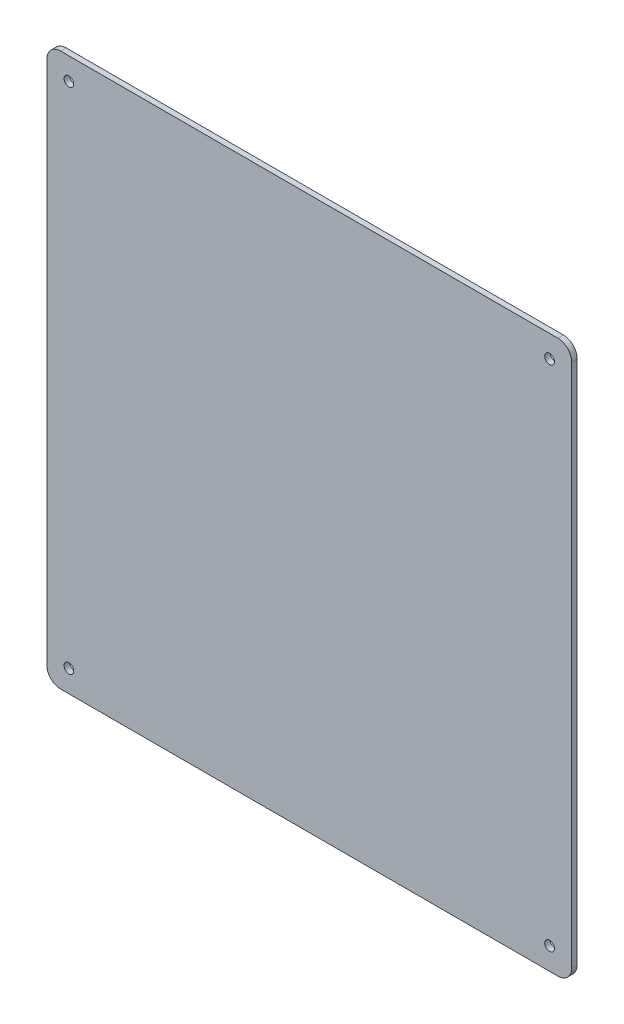
ISO-10303-21;
HEADER;
FILE_DESCRIPTION(('STEP AP214'),'2;1');
FILE_NAME('part.step','',(''),(''),'','','');
FILE_SCHEMA(('AUTOMOTIVE_DESIGN { 1 0 10303 214 1 1 1 1 }'));
ENDSEC;
DATA;
#1=APPLICATION_CONTEXT('core data for automotive mechanical design processes');
#2=APPLICATION_PROTOCOL_DEFINITION('international standard','automotive_design',2000,#1);
#3=PRODUCT_CONTEXT('',#1,'mechanical');
#4=PRODUCT('Part','Part','',(#3));
#5=PRODUCT_RELATED_PRODUCT_CATEGORY('part','',(#4));
#6=PRODUCT_DEFINITION_FORMATION('','',#4);
#7=PRODUCT_DEFINITION_CONTEXT('part definition',#1,'design');
#8=PRODUCT_DEFINITION('design','',#6,#7);
#9=PRODUCT_DEFINITION_SHAPE('','',#8);
#10=(LENGTH_UNIT() NAMED_UNIT(*) SI_UNIT(.MILLI.,.METRE.));
#11=(NAMED_UNIT(*) PLANE_ANGLE_UNIT() SI_UNIT($,.RADIAN.));
#12=(NAMED_UNIT(*) SI_UNIT($,.STERADIAN.) SOLID_ANGLE_UNIT());
#13=UNCERTAINTY_MEASURE_WITH_UNIT(LENGTH_MEASURE(1.E-05),#10,'distance_accuracy_value','');
#14=(GEOMETRIC_REPRESENTATION_CONTEXT(3) GLOBAL_UNCERTAINTY_ASSIGNED_CONTEXT((#13)) GLOBAL_UNIT_ASSIGNED_CONTEXT((#10,
#11,#12)) REPRESENTATION_CONTEXT('',''));
#15=CARTESIAN_POINT('',(0.,0.,0.));
#16=DIRECTION('',(0.,0.,1.));
#17=DIRECTION('',(1.,0.,0.));
#18=AXIS2_PLACEMENT_3D('',#15,#16,#17);
#19=CARTESIAN_POINT('',(-133.612137779047,74.3506493506493,2.));
#20=DIRECTION('',(1.,0.,0.));
#21=DIRECTION('',(0.,1.,0.));
#22=AXIS2_PLACEMENT_3D('',#19,#20,#21);
#23=PLANE('',#22);
#24=DIRECTION('',(0.,-1.,0.));
#25=VECTOR('',#24,1.);
#26=CARTESIAN_POINT('',(-133.612137779047,74.3506493506493,0.));
#27=LINE('',#26,#25);
#28=CARTESIAN_POINT('',(-133.612137779047,69.3506493506493,0.));
#29=VERTEX_POINT('',#28);
#30=CARTESIAN_POINT('',(-133.612137779047,-120.649350649351,0.));
#31=VERTEX_POINT('',#30);
#32=EDGE_CURVE('E158',#29,#31,#27,.T.);
#33=ORIENTED_EDGE('',*,*,#32,.T.);
#34=DIRECTION('',(0.,0.,-1.));
#35=VECTOR('',#34,1.);
#36=CARTESIAN_POINT('',(-133.612137779047,-120.649350649351,2.));
#37=LINE('',#36,#35);
#38=CARTESIAN_POINT('',(-133.612137779047,-120.649350649351,2.));
#39=VERTEX_POINT('',#38);
#40=EDGE_CURVE('E11',#31,#39,#37,.F.);
#41=ORIENTED_EDGE('',*,*,#40,.T.);
#42=DIRECTION('',(0.,-1.,0.));
#43=VECTOR('',#42,1.);
#44=CARTESIAN_POINT('',(-133.612137779047,74.3506493506493,2.));
#45=LINE('',#44,#43);
#46=CARTESIAN_POINT('',(-133.612137779047,69.3506493506493,2.));
#47=VERTEX_POINT('',#46);
#48=EDGE_CURVE('E126',#47,#39,#45,.T.);
#49=ORIENTED_EDGE('',*,*,#48,.F.);
#50=DIRECTION('',(0.,0.,-1.));
#51=VECTOR('',#50,1.);
#52=CARTESIAN_POINT('',(-133.612137779047,69.3506493506493,2.));
#53=LINE('',#52,#51);
#54=EDGE_CURVE('E42',#47,#29,#53,.T.);
#55=ORIENTED_EDGE('',*,*,#54,.T.);
#56=EDGE_LOOP('',(#33,#41,#49,#55));
#57=FACE_BOUND('',#56,.T.);
#58=ADVANCED_FACE('F34',(#57),#23,.F.);
#59=CARTESIAN_POINT('',(-133.612137779047,-125.649350649351,2.));
#60=DIRECTION('',(0.,1.,0.));
#61=DIRECTION('',(0.,0.,1.));
#62=AXIS2_PLACEMENT_3D('',#59,#60,#61);
#63=PLANE('',#62);
#64=DIRECTION('',(1.,0.,0.));
#65=VECTOR('',#64,1.);
#66=CARTESIAN_POINT('',(-133.612137779047,-125.649350649351,0.));
#67=LINE('',#66,#65);
#68=CARTESIAN_POINT('',(-128.612137779047,-125.649350649351,0.));
#69=VERTEX_POINT('',#68);
#70=CARTESIAN_POINT('',(51.3878622209533,-125.649350649351,0.));
#71=VERTEX_POINT('',#70);
#72=EDGE_CURVE('E131',#69,#71,#67,.T.);
#73=ORIENTED_EDGE('',*,*,#72,.T.);
#74=DIRECTION('',(0.,0.,-1.));
#75=VECTOR('',#74,1.);
#76=CARTESIAN_POINT('',(51.3878622209533,-125.649350649351,2.));
#77=LINE('',#76,#75);
#78=CARTESIAN_POINT('',(51.3878622209533,-125.649350649351,2.));
#79=VERTEX_POINT('',#78);
#80=EDGE_CURVE('E49',#71,#79,#77,.F.);
#81=ORIENTED_EDGE('',*,*,#80,.T.);
#82=DIRECTION('',(1.,0.,0.));
#83=VECTOR('',#82,1.);
#84=CARTESIAN_POINT('',(-133.612137779047,-125.649350649351,2.));
#85=LINE('',#84,#83);
#86=CARTESIAN_POINT('',(-128.612137779047,-125.649350649351,2.));
#87=VERTEX_POINT('',#86);
#88=EDGE_CURVE('E129',#87,#79,#85,.T.);
#89=ORIENTED_EDGE('',*,*,#88,.F.);
#90=DIRECTION('',(0.,0.,-1.));
#91=VECTOR('',#90,1.);
#92=CARTESIAN_POINT('',(-128.612137779047,-125.649350649351,2.));
#93=LINE('',#92,#91);
#94=EDGE_CURVE('E150',#87,#69,#93,.T.);
#95=ORIENTED_EDGE('',*,*,#94,.T.);
#96=EDGE_LOOP('',(#73,#81,#89,#95));
#97=FACE_BOUND('',#96,.T.);
#98=ADVANCED_FACE('F218',(#97),#63,.F.);
#99=CARTESIAN_POINT('',(56.3878622209533,74.3506493506493,2.));
#100=DIRECTION('',(-1.,0.,0.));
#101=DIRECTION('',(0.,-1.,0.));
#102=AXIS2_PLACEMENT_3D('',#99,#100,#101);
#103=PLANE('',#102);
#104=DIRECTION('',(0.,1.,0.));
#105=VECTOR('',#104,1.);
#106=CARTESIAN_POINT('',(56.3878622209533,74.3506493506493,0.));
#107=LINE('',#106,#105);
#108=CARTESIAN_POINT('',(56.3878622209533,-120.649350649351,0.));
#109=VERTEX_POINT('',#108);
#110=CARTESIAN_POINT('',(56.3878622209533,69.3506493506493,0.));
#111=VERTEX_POINT('',#110);
#112=EDGE_CURVE('E127',#109,#111,#107,.T.);
#113=ORIENTED_EDGE('',*,*,#112,.T.);
#114=DIRECTION('',(0.,0.,-1.));
#115=VECTOR('',#114,1.);
#116=CARTESIAN_POINT('',(56.3878622209533,69.3506493506493,2.));
#117=LINE('',#116,#115);
#118=CARTESIAN_POINT('',(56.3878622209533,69.3506493506493,2.));
#119=VERTEX_POINT('',#118);
#120=EDGE_CURVE('E105',#111,#119,#117,.F.);
#121=ORIENTED_EDGE('',*,*,#120,.T.);
#122=DIRECTION('',(0.,1.,0.));
#123=VECTOR('',#122,1.);
#124=CARTESIAN_POINT('',(56.3878622209533,74.3506493506493,2.));
#125=LINE('',#124,#123);
#126=CARTESIAN_POINT('',(56.3878622209533,-120.649350649351,2.));
#127=VERTEX_POINT('',#126);
#128=EDGE_CURVE('E170',#127,#119,#125,.T.);
#129=ORIENTED_EDGE('',*,*,#128,.F.);
#130=DIRECTION('',(0.,0.,-1.));
#131=VECTOR('',#130,1.);
#132=CARTESIAN_POINT('',(56.3878622209533,-120.649350649351,2.));
#133=LINE('',#132,#131);
#134=EDGE_CURVE('E110',#127,#109,#133,.T.);
#135=ORIENTED_EDGE('',*,*,#134,.T.);
#136=EDGE_LOOP('',(#113,#121,#129,#135));
#137=FACE_BOUND('',#136,.T.);
#138=ADVANCED_FACE('F215',(#137),#103,.F.);
#139=CARTESIAN_POINT('',(-133.612137779047,74.3506493506493,2.));
#140=DIRECTION('',(0.,-1.,0.));
#141=DIRECTION('',(0.,0.,-1.));
#142=AXIS2_PLACEMENT_3D('',#139,#140,#141);
#143=PLANE('',#142);
#144=DIRECTION('',(-1.,0.,0.));
#145=VECTOR('',#144,1.);
#146=CARTESIAN_POINT('',(-133.612137779047,74.3506493506493,2.));
#147=LINE('',#146,#145);
#148=CARTESIAN_POINT('',(51.3878622209533,74.3506493506493,2.));
#149=VERTEX_POINT('',#148);
#150=CARTESIAN_POINT('',(-128.612137779047,74.3506493506493,2.));
#151=VERTEX_POINT('',#150);
#152=EDGE_CURVE('E120',#149,#151,#147,.T.);
#153=ORIENTED_EDGE('',*,*,#152,.F.);
#154=DIRECTION('',(0.,0.,-1.));
#155=VECTOR('',#154,1.);
#156=CARTESIAN_POINT('',(51.3878622209533,74.3506493506493,2.));
#157=LINE('',#156,#155);
#158=CARTESIAN_POINT('',(51.3878622209533,74.3506493506493,0.));
#159=VERTEX_POINT('',#158);
#160=EDGE_CURVE('E104',#149,#159,#157,.T.);
#161=ORIENTED_EDGE('',*,*,#160,.T.);
#162=DIRECTION('',(-1.,0.,0.));
#163=VECTOR('',#162,1.);
#164=CARTESIAN_POINT('',(-133.612137779047,74.3506493506493,0.));
#165=LINE('',#164,#163);
#166=CARTESIAN_POINT('',(-128.612137779047,74.3506493506493,0.));
#167=VERTEX_POINT('',#166);
#168=EDGE_CURVE('E117',#159,#167,#165,.T.);
#169=ORIENTED_EDGE('',*,*,#168,.T.);
#170=DIRECTION('',(0.,0.,-1.));
#171=VECTOR('',#170,1.);
#172=CARTESIAN_POINT('',(-128.612137779047,74.3506493506493,2.));
#173=LINE('',#172,#171);
#174=EDGE_CURVE('E122',#167,#151,#173,.F.);
#175=ORIENTED_EDGE('',*,*,#174,.T.);
#176=EDGE_LOOP('',(#153,#161,#169,#175));
#177=FACE_BOUND('',#176,.T.);
#178=ADVANCED_FACE('F116',(#177),#143,.F.);
#179=CARTESIAN_POINT('',(0.,0.,2.));
#180=DIRECTION('',(0.,0.,1.));
#181=DIRECTION('',(1.,0.,0.));
#182=AXIS2_PLACEMENT_3D('',#179,#180,#181);
#183=PLANE('',#182);
#184=CARTESIAN_POINT('',(48.3878622209533,66.3506493506493,2.));
#185=DIRECTION('',(0.,0.,1.));
#186=DIRECTION('',(1.,0.,0.));
#187=AXIS2_PLACEMENT_3D('',#184,#185,#186);
#188=CIRCLE('',#187,1.75);
#189=CARTESIAN_POINT('',(50.1378622209533,66.3506493506493,2.));
#190=VERTEX_POINT('',#189);
#191=EDGE_CURVE('E184',#190,#190,#188,.T.);
#192=ORIENTED_EDGE('',*,*,#191,.F.);
#193=EDGE_LOOP('',(#192));
#194=FACE_BOUND('',#193,.T.);
#195=CARTESIAN_POINT('',(-125.612137779047,-117.649350649351,2.));
#196=DIRECTION('',(0.,0.,1.));
#197=DIRECTION('',(1.,0.,0.));
#198=AXIS2_PLACEMENT_3D('',#195,#196,#197);
#199=CIRCLE('',#198,1.75);
#200=CARTESIAN_POINT('',(-123.862137779047,-117.649350649351,2.));
#201=VERTEX_POINT('',#200);
#202=EDGE_CURVE('E177',#201,#201,#199,.T.);
#203=ORIENTED_EDGE('',*,*,#202,.F.);
#204=EDGE_LOOP('',(#203));
#205=FACE_BOUND('',#204,.T.);
#206=CARTESIAN_POINT('',(48.3878622209533,-117.649350649351,2.));
#207=DIRECTION('',(0.,0.,1.));
#208=DIRECTION('',(1.,0.,0.));
#209=AXIS2_PLACEMENT_3D('',#206,#207,#208);
#210=CIRCLE('',#209,1.75);
#211=CARTESIAN_POINT('',(50.1378622209533,-117.649350649351,2.));
#212=VERTEX_POINT('',#211);
#213=EDGE_CURVE('E189',#212,#212,#210,.T.);
#214=ORIENTED_EDGE('',*,*,#213,.F.);
#215=EDGE_LOOP('',(#214));
#216=FACE_BOUND('',#215,.T.);
#217=CARTESIAN_POINT('',(-125.612137779047,66.3506493506493,2.));
#218=DIRECTION('',(0.,0.,1.));
#219=DIRECTION('',(1.,0.,0.));
#220=AXIS2_PLACEMENT_3D('',#217,#218,#219);
#221=CIRCLE('',#220,1.75);
#222=CARTESIAN_POINT('',(-123.862137779047,66.3506493506493,2.));
#223=VERTEX_POINT('',#222);
#224=EDGE_CURVE('E166',#223,#223,#221,.T.);
#225=ORIENTED_EDGE('',*,*,#224,.F.);
#226=EDGE_LOOP('',(#225));
#227=FACE_BOUND('',#226,.T.);
#228=ORIENTED_EDGE('',*,*,#128,.T.);
#229=CARTESIAN_POINT('',(51.3878622209533,69.3506493506493,2.));
#230=DIRECTION('',(0.,0.,1.));
#231=DIRECTION('',(1.,0.,0.));
#232=AXIS2_PLACEMENT_3D('',#229,#230,#231);
#233=CIRCLE('',#232,5.);
#234=EDGE_CURVE('E148',#119,#149,#233,.T.);
#235=ORIENTED_EDGE('',*,*,#234,.T.);
#236=ORIENTED_EDGE('',*,*,#152,.T.);
#237=CARTESIAN_POINT('',(-128.612137779047,69.3506493506493,2.));
#238=DIRECTION('',(0.,0.,1.));
#239=DIRECTION('',(1.,0.,0.));
#240=AXIS2_PLACEMENT_3D('',#237,#238,#239);
#241=CIRCLE('',#240,5.);
#242=EDGE_CURVE('E143',#151,#47,#241,.T.);
#243=ORIENTED_EDGE('',*,*,#242,.T.);
#244=ORIENTED_EDGE('',*,*,#48,.T.);
#245=CARTESIAN_POINT('',(-128.612137779047,-120.649350649351,2.));
#246=DIRECTION('',(0.,0.,1.));
#247=DIRECTION('',(1.,0.,0.));
#248=AXIS2_PLACEMENT_3D('',#245,#246,#247);
#249=CIRCLE('',#248,5.);
#250=EDGE_CURVE('E56',#39,#87,#249,.T.);
#251=ORIENTED_EDGE('',*,*,#250,.T.);
#252=ORIENTED_EDGE('',*,*,#88,.T.);
#253=CARTESIAN_POINT('',(51.3878622209533,-120.649350649351,2.));
#254=DIRECTION('',(0.,0.,1.));
#255=DIRECTION('',(1.,0.,0.));
#256=AXIS2_PLACEMENT_3D('',#253,#254,#255);
#257=CIRCLE('',#256,5.);
#258=EDGE_CURVE('E146',#79,#127,#257,.T.);
#259=ORIENTED_EDGE('',*,*,#258,.T.);
#260=EDGE_LOOP('',(#228,#235,#236,#243,#244,#251,#252,#259));
#261=FACE_BOUND('',#260,.T.);
#262=ADVANCED_FACE('F205',(#194,#205,#216,#227,#261),#183,.T.);
#263=CARTESIAN_POINT('',(0.,0.,0.));
#264=DIRECTION('',(0.,0.,1.));
#265=DIRECTION('',(1.,0.,0.));
#266=AXIS2_PLACEMENT_3D('',#263,#264,#265);
#267=PLANE('',#266);
#268=CARTESIAN_POINT('',(48.3878622209533,66.3506493506493,0.));
#269=DIRECTION('',(0.,0.,1.));
#270=DIRECTION('',(1.,0.,0.));
#271=AXIS2_PLACEMENT_3D('',#268,#269,#270);
#272=CIRCLE('',#271,1.75);
#273=CARTESIAN_POINT('',(50.1378622209533,66.3506493506493,0.));
#274=VERTEX_POINT('',#273);
#275=EDGE_CURVE('E175',#274,#274,#272,.T.);
#276=ORIENTED_EDGE('',*,*,#275,.T.);
#277=EDGE_LOOP('',(#276));
#278=FACE_BOUND('',#277,.T.);
#279=CARTESIAN_POINT('',(-125.612137779047,-117.649350649351,0.));
#280=DIRECTION('',(0.,0.,1.));
#281=DIRECTION('',(1.,0.,0.));
#282=AXIS2_PLACEMENT_3D('',#279,#280,#281);
#283=CIRCLE('',#282,1.75);
#284=CARTESIAN_POINT('',(-123.862137779047,-117.649350649351,0.));
#285=VERTEX_POINT('',#284);
#286=EDGE_CURVE('E180',#285,#285,#283,.T.);
#287=ORIENTED_EDGE('',*,*,#286,.T.);
#288=EDGE_LOOP('',(#287));
#289=FACE_BOUND('',#288,.T.);
#290=CARTESIAN_POINT('',(48.3878622209533,-117.649350649351,0.));
#291=DIRECTION('',(0.,0.,1.));
#292=DIRECTION('',(1.,0.,0.));
#293=AXIS2_PLACEMENT_3D('',#290,#291,#292);
#294=CIRCLE('',#293,1.75);
#295=CARTESIAN_POINT('',(50.1378622209533,-117.649350649351,0.));
#296=VERTEX_POINT('',#295);
#297=EDGE_CURVE('E181',#296,#296,#294,.T.);
#298=ORIENTED_EDGE('',*,*,#297,.T.);
#299=EDGE_LOOP('',(#298));
#300=FACE_BOUND('',#299,.T.);
#301=CARTESIAN_POINT('',(-125.612137779047,66.3506493506493,0.));
#302=DIRECTION('',(0.,0.,1.));
#303=DIRECTION('',(1.,0.,0.));
#304=AXIS2_PLACEMENT_3D('',#301,#302,#303);
#305=CIRCLE('',#304,1.75);
#306=CARTESIAN_POINT('',(-123.862137779047,66.3506493506493,0.));
#307=VERTEX_POINT('',#306);
#308=EDGE_CURVE('E163',#307,#307,#305,.T.);
#309=ORIENTED_EDGE('',*,*,#308,.T.);
#310=EDGE_LOOP('',(#309));
#311=FACE_BOUND('',#310,.T.);
#312=ORIENTED_EDGE('',*,*,#168,.F.);
#313=CARTESIAN_POINT('',(51.3878622209533,69.3506493506493,0.));
#314=DIRECTION('',(0.,0.,1.));
#315=DIRECTION('',(1.,0.,0.));
#316=AXIS2_PLACEMENT_3D('',#313,#314,#315);
#317=CIRCLE('',#316,5.);
#318=EDGE_CURVE('E100',#159,#111,#317,.F.);
#319=ORIENTED_EDGE('',*,*,#318,.T.);
#320=ORIENTED_EDGE('',*,*,#112,.F.);
#321=CARTESIAN_POINT('',(51.3878622209533,-120.649350649351,0.));
#322=DIRECTION('',(0.,0.,1.));
#323=DIRECTION('',(1.,0.,0.));
#324=AXIS2_PLACEMENT_3D('',#321,#322,#323);
#325=CIRCLE('',#324,5.);
#326=EDGE_CURVE('E111',#109,#71,#325,.F.);
#327=ORIENTED_EDGE('',*,*,#326,.T.);
#328=ORIENTED_EDGE('',*,*,#72,.F.);
#329=CARTESIAN_POINT('',(-128.612137779047,-120.649350649351,0.));
#330=DIRECTION('',(0.,0.,1.));
#331=DIRECTION('',(1.,0.,0.));
#332=AXIS2_PLACEMENT_3D('',#329,#330,#331);
#333=CIRCLE('',#332,5.);
#334=EDGE_CURVE('E137',#69,#31,#333,.F.);
#335=ORIENTED_EDGE('',*,*,#334,.T.);
#336=ORIENTED_EDGE('',*,*,#32,.F.);
#337=CARTESIAN_POINT('',(-128.612137779047,69.3506493506493,0.));
#338=DIRECTION('',(0.,0.,1.));
#339=DIRECTION('',(1.,0.,0.));
#340=AXIS2_PLACEMENT_3D('',#337,#338,#339);
#341=CIRCLE('',#340,5.);
#342=EDGE_CURVE('E121',#29,#167,#341,.F.);
#343=ORIENTED_EDGE('',*,*,#342,.T.);
#344=EDGE_LOOP('',(#312,#319,#320,#327,#328,#335,#336,#343));
#345=FACE_BOUND('',#344,.T.);
#346=ADVANCED_FACE('F124',(#278,#289,#300,#311,#345),#267,.F.);
#347=CARTESIAN_POINT('',(-125.612137779047,66.3506493506493,0.));
#348=DIRECTION('',(0.,0.,1.));
#349=DIRECTION('',(1.,0.,0.));
#350=AXIS2_PLACEMENT_3D('',#347,#348,#349);
#351=CYLINDRICAL_SURFACE('',#350,1.75);
#352=ORIENTED_EDGE('',*,*,#308,.F.);
#353=EDGE_LOOP('',(#352));
#354=FACE_BOUND('',#353,.T.);
#355=ORIENTED_EDGE('',*,*,#224,.T.);
#356=EDGE_LOOP('',(#355));
#357=FACE_BOUND('',#356,.T.);
#358=ADVANCED_FACE('F201',(#354,#357),#351,.F.);
#359=CARTESIAN_POINT('',(48.3878622209533,-117.649350649351,0.));
#360=DIRECTION('',(0.,0.,1.));
#361=DIRECTION('',(1.,0.,0.));
#362=AXIS2_PLACEMENT_3D('',#359,#360,#361);
#363=CYLINDRICAL_SURFACE('',#362,1.75);
#364=ORIENTED_EDGE('',*,*,#297,.F.);
#365=EDGE_LOOP('',(#364));
#366=FACE_BOUND('',#365,.T.);
#367=ORIENTED_EDGE('',*,*,#213,.T.);
#368=EDGE_LOOP('',(#367));
#369=FACE_BOUND('',#368,.T.);
#370=ADVANCED_FACE('F197',(#366,#369),#363,.F.);
#371=CARTESIAN_POINT('',(-125.612137779047,-117.649350649351,0.));
#372=DIRECTION('',(0.,0.,1.));
#373=DIRECTION('',(1.,0.,0.));
#374=AXIS2_PLACEMENT_3D('',#371,#372,#373);
#375=CYLINDRICAL_SURFACE('',#374,1.75);
#376=ORIENTED_EDGE('',*,*,#286,.F.);
#377=EDGE_LOOP('',(#376));
#378=FACE_BOUND('',#377,.T.);
#379=ORIENTED_EDGE('',*,*,#202,.T.);
#380=EDGE_LOOP('',(#379));
#381=FACE_BOUND('',#380,.T.);
#382=ADVANCED_FACE('F200',(#378,#381),#375,.F.);
#383=CARTESIAN_POINT('',(48.3878622209533,66.3506493506493,0.));
#384=DIRECTION('',(0.,0.,1.));
#385=DIRECTION('',(1.,0.,0.));
#386=AXIS2_PLACEMENT_3D('',#383,#384,#385);
#387=CYLINDRICAL_SURFACE('',#386,1.75);
#388=ORIENTED_EDGE('',*,*,#275,.F.);
#389=EDGE_LOOP('',(#388));
#390=FACE_BOUND('',#389,.T.);
#391=ORIENTED_EDGE('',*,*,#191,.T.);
#392=EDGE_LOOP('',(#391));
#393=FACE_BOUND('',#392,.T.);
#394=ADVANCED_FACE('F236',(#390,#393),#387,.F.);
#395=CARTESIAN_POINT('',(51.3878622209533,69.3506493506493,2.));
#396=DIRECTION('',(0.,0.,-1.));
#397=DIRECTION('',(-1.,0.,0.));
#398=AXIS2_PLACEMENT_3D('',#395,#396,#397);
#399=CYLINDRICAL_SURFACE('',#398,5.);
#400=ORIENTED_EDGE('',*,*,#234,.F.);
#401=ORIENTED_EDGE('',*,*,#120,.F.);
#402=ORIENTED_EDGE('',*,*,#318,.F.);
#403=ORIENTED_EDGE('',*,*,#160,.F.);
#404=EDGE_LOOP('',(#400,#401,#402,#403));
#405=FACE_BOUND('',#404,.T.);
#406=ADVANCED_FACE('F103',(#405),#399,.T.);
#407=CARTESIAN_POINT('',(51.3878622209533,-120.649350649351,2.));
#408=DIRECTION('',(0.,0.,-1.));
#409=DIRECTION('',(-1.,0.,0.));
#410=AXIS2_PLACEMENT_3D('',#407,#408,#409);
#411=CYLINDRICAL_SURFACE('',#410,5.);
#412=ORIENTED_EDGE('',*,*,#258,.F.);
#413=ORIENTED_EDGE('',*,*,#80,.F.);
#414=ORIENTED_EDGE('',*,*,#326,.F.);
#415=ORIENTED_EDGE('',*,*,#134,.F.);
#416=EDGE_LOOP('',(#412,#413,#414,#415));
#417=FACE_BOUND('',#416,.T.);
#418=ADVANCED_FACE('F217',(#417),#411,.T.);
#419=CARTESIAN_POINT('',(-128.612137779047,-120.649350649351,2.));
#420=DIRECTION('',(0.,0.,-1.));
#421=DIRECTION('',(-1.,0.,0.));
#422=AXIS2_PLACEMENT_3D('',#419,#420,#421);
#423=CYLINDRICAL_SURFACE('',#422,5.);
#424=ORIENTED_EDGE('',*,*,#250,.F.);
#425=ORIENTED_EDGE('',*,*,#40,.F.);
#426=ORIENTED_EDGE('',*,*,#334,.F.);
#427=ORIENTED_EDGE('',*,*,#94,.F.);
#428=EDGE_LOOP('',(#424,#425,#426,#427));
#429=FACE_BOUND('',#428,.T.);
#430=ADVANCED_FACE('F221',(#429),#423,.T.);
#431=CARTESIAN_POINT('',(-128.612137779047,69.3506493506493,2.));
#432=DIRECTION('',(0.,0.,-1.));
#433=DIRECTION('',(-1.,0.,0.));
#434=AXIS2_PLACEMENT_3D('',#431,#432,#433);
#435=CYLINDRICAL_SURFACE('',#434,5.);
#436=ORIENTED_EDGE('',*,*,#242,.F.);
#437=ORIENTED_EDGE('',*,*,#174,.F.);
#438=ORIENTED_EDGE('',*,*,#342,.F.);
#439=ORIENTED_EDGE('',*,*,#54,.F.);
#440=EDGE_LOOP('',(#436,#437,#438,#439));
#441=FACE_BOUND('',#440,.T.);
#442=ADVANCED_FACE('F36',(#441),#435,.T.);
#443=CLOSED_SHELL('',(#58,#98,#138,#178,#262,#346,#358,#370,#382,#394,#406,#418,#430,#442));
#444=MANIFOLD_SOLID_BREP('B2',#443);
#445=ADVANCED_BREP_SHAPE_REPRESENTATION('',(#18,#444),#14);
#446=SHAPE_DEFINITION_REPRESENTATION(#9,#445);
ENDSEC;
END-ISO-10303-21;
